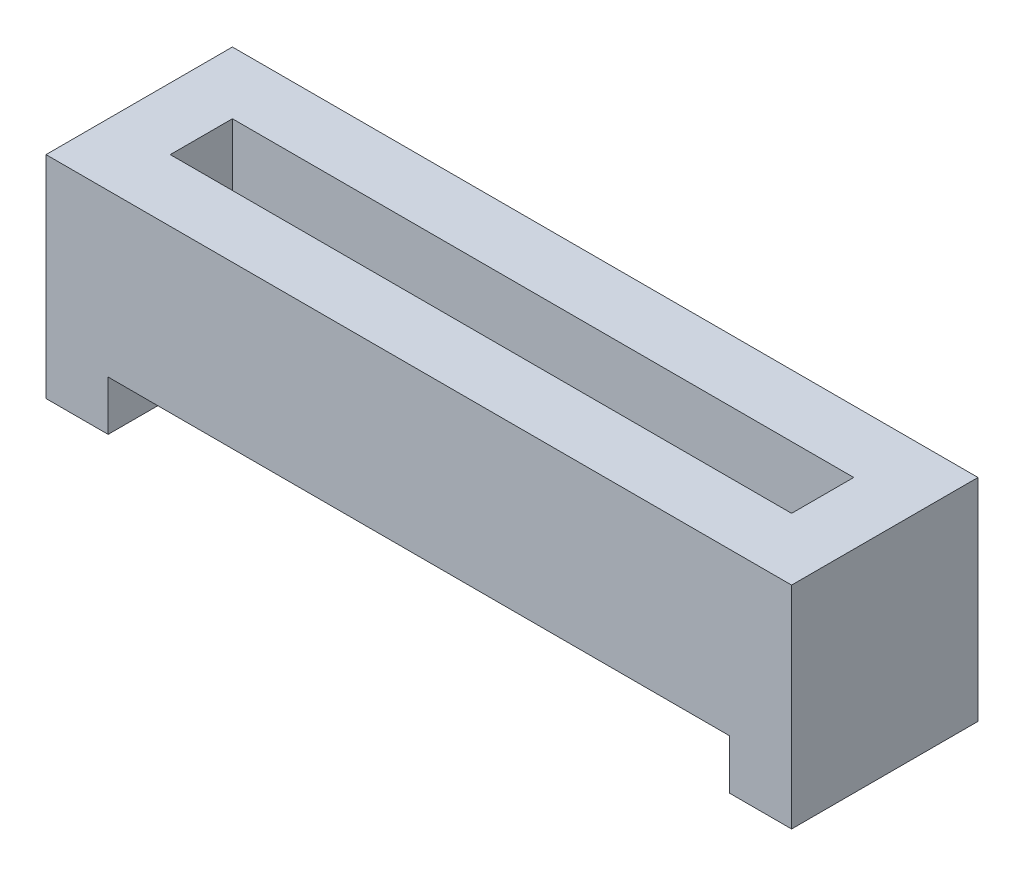
ISO-10303-21;
HEADER;
FILE_DESCRIPTION(('STEP AP214'),'2;1');
FILE_NAME('part.step','',(''),(''),'','','');
FILE_SCHEMA(('AUTOMOTIVE_DESIGN { 1 0 10303 214 1 1 1 1 }'));
ENDSEC;
DATA;
#1=APPLICATION_CONTEXT('core data for automotive mechanical design processes');
#2=APPLICATION_PROTOCOL_DEFINITION('international standard','automotive_design',2000,#1);
#3=PRODUCT_CONTEXT('',#1,'mechanical');
#4=PRODUCT('Part','Part','',(#3));
#5=PRODUCT_RELATED_PRODUCT_CATEGORY('part','',(#4));
#6=PRODUCT_DEFINITION_FORMATION('','',#4);
#7=PRODUCT_DEFINITION_CONTEXT('part definition',#1,'design');
#8=PRODUCT_DEFINITION('design','',#6,#7);
#9=PRODUCT_DEFINITION_SHAPE('','',#8);
#10=(LENGTH_UNIT() NAMED_UNIT(*) SI_UNIT(.MILLI.,.METRE.));
#11=(NAMED_UNIT(*) PLANE_ANGLE_UNIT() SI_UNIT($,.RADIAN.));
#12=(NAMED_UNIT(*) SI_UNIT($,.STERADIAN.) SOLID_ANGLE_UNIT());
#13=UNCERTAINTY_MEASURE_WITH_UNIT(LENGTH_MEASURE(1.E-05),#10,'distance_accuracy_value','');
#14=(GEOMETRIC_REPRESENTATION_CONTEXT(3) GLOBAL_UNCERTAINTY_ASSIGNED_CONTEXT((#13)) GLOBAL_UNIT_ASSIGNED_CONTEXT((#10,
#11,#12)) REPRESENTATION_CONTEXT('',''));
#15=CARTESIAN_POINT('',(0.,0.,0.));
#16=DIRECTION('',(0.,0.,1.));
#17=DIRECTION('',(1.,0.,0.));
#18=AXIS2_PLACEMENT_3D('',#15,#16,#17);
#19=CARTESIAN_POINT('',(30.,13.,7.5));
#20=DIRECTION('',(-1.,0.,0.));
#21=DIRECTION('',(0.,0.,1.));
#22=AXIS2_PLACEMENT_3D('',#19,#20,#21);
#23=PLANE('',#22);
#24=DIRECTION('',(0.,-1.,0.));
#25=VECTOR('',#24,1.);
#26=CARTESIAN_POINT('',(30.,13.,7.5));
#27=LINE('',#26,#25);
#28=CARTESIAN_POINT('',(30.,13.,7.5));
#29=VERTEX_POINT('',#28);
#30=CARTESIAN_POINT('',(30.,-4.,7.5));
#31=VERTEX_POINT('',#30);
#32=EDGE_CURVE('E205',#29,#31,#27,.T.);
#33=ORIENTED_EDGE('',*,*,#32,.T.);
#34=DIRECTION('',(0.,0.,-1.));
#35=VECTOR('',#34,1.);
#36=CARTESIAN_POINT('',(30.,-4.,7.5));
#37=LINE('',#36,#35);
#38=CARTESIAN_POINT('',(30.,-4.,-7.5));
#39=VERTEX_POINT('',#38);
#40=EDGE_CURVE('E158',#31,#39,#37,.T.);
#41=ORIENTED_EDGE('',*,*,#40,.T.);
#42=DIRECTION('',(0.,-1.,0.));
#43=VECTOR('',#42,1.);
#44=CARTESIAN_POINT('',(30.,13.,-7.5));
#45=LINE('',#44,#43);
#46=CARTESIAN_POINT('',(30.,13.,-7.5));
#47=VERTEX_POINT('',#46);
#48=EDGE_CURVE('E11',#47,#39,#45,.T.);
#49=ORIENTED_EDGE('',*,*,#48,.F.);
#50=DIRECTION('',(0.,0.,-1.));
#51=VECTOR('',#50,1.);
#52=CARTESIAN_POINT('',(30.,13.,7.5));
#53=LINE('',#52,#51);
#54=EDGE_CURVE('E195',#29,#47,#53,.T.);
#55=ORIENTED_EDGE('',*,*,#54,.F.);
#56=EDGE_LOOP('',(#33,#41,#49,#55));
#57=FACE_BOUND('',#56,.T.);
#58=ADVANCED_FACE('F33',(#57),#23,.F.);
#59=CARTESIAN_POINT('',(-30.,13.,-7.5));
#60=DIRECTION('',(0.,0.,1.));
#61=DIRECTION('',(1.,0.,0.));
#62=AXIS2_PLACEMENT_3D('',#59,#60,#61);
#63=PLANE('',#62);
#64=ORIENTED_EDGE('',*,*,#48,.T.);
#65=DIRECTION('',(-1.,0.,0.));
#66=VECTOR('',#65,1.);
#67=CARTESIAN_POINT('',(30.,-4.,-7.5));
#68=LINE('',#67,#66);
#69=CARTESIAN_POINT('',(25.,-4.,-7.5));
#70=VERTEX_POINT('',#69);
#71=EDGE_CURVE('E167',#39,#70,#68,.T.);
#72=ORIENTED_EDGE('',*,*,#71,.T.);
#73=DIRECTION('',(0.,1.,0.));
#74=VECTOR('',#73,1.);
#75=CARTESIAN_POINT('',(25.,-4.,-7.5));
#76=LINE('',#75,#74);
#77=CARTESIAN_POINT('',(25.,0.,-7.5));
#78=VERTEX_POINT('',#77);
#79=EDGE_CURVE('E170',#70,#78,#76,.T.);
#80=ORIENTED_EDGE('',*,*,#79,.T.);
#81=DIRECTION('',(-1.,0.,0.));
#82=VECTOR('',#81,1.);
#83=CARTESIAN_POINT('',(-30.,0.,-7.5));
#84=LINE('',#83,#82);
#85=CARTESIAN_POINT('',(-25.,0.,-7.5));
#86=VERTEX_POINT('',#85);
#87=EDGE_CURVE('E194',#78,#86,#84,.T.);
#88=ORIENTED_EDGE('',*,*,#87,.T.);
#89=DIRECTION('',(0.,1.,0.));
#90=VECTOR('',#89,1.);
#91=CARTESIAN_POINT('',(-25.,-4.,-7.5));
#92=LINE('',#91,#90);
#93=CARTESIAN_POINT('',(-25.,-4.,-7.5));
#94=VERTEX_POINT('',#93);
#95=EDGE_CURVE('E191',#94,#86,#92,.T.);
#96=ORIENTED_EDGE('',*,*,#95,.F.);
#97=DIRECTION('',(1.,0.,0.));
#98=VECTOR('',#97,1.);
#99=CARTESIAN_POINT('',(-30.,-4.,-7.5));
#100=LINE('',#99,#98);
#101=CARTESIAN_POINT('',(-30.,-4.,-7.5));
#102=VERTEX_POINT('',#101);
#103=EDGE_CURVE('E179',#102,#94,#100,.T.);
#104=ORIENTED_EDGE('',*,*,#103,.F.);
#105=DIRECTION('',(0.,-1.,0.));
#106=VECTOR('',#105,1.);
#107=CARTESIAN_POINT('',(-30.,13.,-7.5));
#108=LINE('',#107,#106);
#109=CARTESIAN_POINT('',(-30.,13.,-7.5));
#110=VERTEX_POINT('',#109);
#111=EDGE_CURVE('E40',#110,#102,#108,.T.);
#112=ORIENTED_EDGE('',*,*,#111,.F.);
#113=DIRECTION('',(-1.,0.,0.));
#114=VECTOR('',#113,1.);
#115=CARTESIAN_POINT('',(-30.,13.,-7.5));
#116=LINE('',#115,#114);
#117=EDGE_CURVE('E198',#47,#110,#116,.T.);
#118=ORIENTED_EDGE('',*,*,#117,.F.);
#119=EDGE_LOOP('',(#64,#72,#80,#88,#96,#104,#112,#118));
#120=FACE_BOUND('',#119,.T.);
#121=ADVANCED_FACE('F220',(#120),#63,.F.);
#122=CARTESIAN_POINT('',(-30.,13.,7.5));
#123=DIRECTION('',(1.,0.,0.));
#124=DIRECTION('',(0.,0.,-1.));
#125=AXIS2_PLACEMENT_3D('',#122,#123,#124);
#126=PLANE('',#125);
#127=ORIENTED_EDGE('',*,*,#111,.T.);
#128=DIRECTION('',(0.,0.,-1.));
#129=VECTOR('',#128,1.);
#130=CARTESIAN_POINT('',(-30.,-4.,7.5));
#131=LINE('',#130,#129);
#132=CARTESIAN_POINT('',(-30.,-4.,7.5));
#133=VERTEX_POINT('',#132);
#134=EDGE_CURVE('E176',#133,#102,#131,.T.);
#135=ORIENTED_EDGE('',*,*,#134,.F.);
#136=DIRECTION('',(0.,-1.,0.));
#137=VECTOR('',#136,1.);
#138=CARTESIAN_POINT('',(-30.,13.,7.5));
#139=LINE('',#138,#137);
#140=CARTESIAN_POINT('',(-30.,13.,7.5));
#141=VERTEX_POINT('',#140);
#142=EDGE_CURVE('E210',#141,#133,#139,.T.);
#143=ORIENTED_EDGE('',*,*,#142,.F.);
#144=DIRECTION('',(0.,0.,1.));
#145=VECTOR('',#144,1.);
#146=CARTESIAN_POINT('',(-30.,13.,7.5));
#147=LINE('',#146,#145);
#148=EDGE_CURVE('E201',#110,#141,#147,.T.);
#149=ORIENTED_EDGE('',*,*,#148,.F.);
#150=EDGE_LOOP('',(#127,#135,#143,#149));
#151=FACE_BOUND('',#150,.T.);
#152=ADVANCED_FACE('F216',(#151),#126,.F.);
#153=CARTESIAN_POINT('',(-30.,13.,7.5));
#154=DIRECTION('',(0.,0.,-1.));
#155=DIRECTION('',(-1.,0.,0.));
#156=AXIS2_PLACEMENT_3D('',#153,#154,#155);
#157=PLANE('',#156);
#158=ORIENTED_EDGE('',*,*,#142,.T.);
#159=DIRECTION('',(-1.,0.,0.));
#160=VECTOR('',#159,1.);
#161=CARTESIAN_POINT('',(-30.,-4.,7.5));
#162=LINE('',#161,#160);
#163=CARTESIAN_POINT('',(-25.,-4.,7.5));
#164=VERTEX_POINT('',#163);
#165=EDGE_CURVE('E183',#164,#133,#162,.T.);
#166=ORIENTED_EDGE('',*,*,#165,.F.);
#167=DIRECTION('',(0.,1.,0.));
#168=VECTOR('',#167,1.);
#169=CARTESIAN_POINT('',(-25.,-4.,7.5));
#170=LINE('',#169,#168);
#171=CARTESIAN_POINT('',(-25.,0.,7.5));
#172=VERTEX_POINT('',#171);
#173=EDGE_CURVE('E186',#164,#172,#170,.T.);
#174=ORIENTED_EDGE('',*,*,#173,.T.);
#175=DIRECTION('',(1.,0.,0.));
#176=VECTOR('',#175,1.);
#177=CARTESIAN_POINT('',(-30.,0.,7.5));
#178=LINE('',#177,#176);
#179=CARTESIAN_POINT('',(25.,0.,7.5));
#180=VERTEX_POINT('',#179);
#181=EDGE_CURVE('E199',#172,#180,#178,.T.);
#182=ORIENTED_EDGE('',*,*,#181,.T.);
#183=DIRECTION('',(0.,1.,0.));
#184=VECTOR('',#183,1.);
#185=CARTESIAN_POINT('',(25.,-4.,7.5));
#186=LINE('',#185,#184);
#187=CARTESIAN_POINT('',(25.,-4.,7.5));
#188=VERTEX_POINT('',#187);
#189=EDGE_CURVE('E173',#188,#180,#186,.T.);
#190=ORIENTED_EDGE('',*,*,#189,.F.);
#191=DIRECTION('',(1.,0.,0.));
#192=VECTOR('',#191,1.);
#193=CARTESIAN_POINT('',(30.,-4.,7.5));
#194=LINE('',#193,#192);
#195=EDGE_CURVE('E161',#188,#31,#194,.T.);
#196=ORIENTED_EDGE('',*,*,#195,.T.);
#197=ORIENTED_EDGE('',*,*,#32,.F.);
#198=DIRECTION('',(1.,0.,0.));
#199=VECTOR('',#198,1.);
#200=CARTESIAN_POINT('',(-30.,13.,7.5));
#201=LINE('',#200,#199);
#202=EDGE_CURVE('E203',#141,#29,#201,.T.);
#203=ORIENTED_EDGE('',*,*,#202,.F.);
#204=EDGE_LOOP('',(#158,#166,#174,#182,#190,#196,#197,#203));
#205=FACE_BOUND('',#204,.T.);
#206=ADVANCED_FACE('F227',(#205),#157,.F.);
#207=CARTESIAN_POINT('',(0.,13.,0.));
#208=DIRECTION('',(0.,-1.,0.));
#209=DIRECTION('',(0.,0.,-1.));
#210=AXIS2_PLACEMENT_3D('',#207,#208,#209);
#211=PLANE('',#210);
#212=DIRECTION('',(-1.,0.,0.));
#213=VECTOR('',#212,1.);
#214=CARTESIAN_POINT('',(-25.,13.,-2.5));
#215=LINE('',#214,#213);
#216=CARTESIAN_POINT('',(25.,13.,-2.5));
#217=VERTEX_POINT('',#216);
#218=CARTESIAN_POINT('',(-25.,13.,-2.5));
#219=VERTEX_POINT('',#218);
#220=EDGE_CURVE('E149',#217,#219,#215,.T.);
#221=ORIENTED_EDGE('',*,*,#220,.F.);
#222=DIRECTION('',(0.,0.,-1.));
#223=VECTOR('',#222,1.);
#224=CARTESIAN_POINT('',(25.,13.,2.5));
#225=LINE('',#224,#223);
#226=CARTESIAN_POINT('',(25.,13.,2.5));
#227=VERTEX_POINT('',#226);
#228=EDGE_CURVE('E47',#227,#217,#225,.T.);
#229=ORIENTED_EDGE('',*,*,#228,.F.);
#230=DIRECTION('',(1.,0.,0.));
#231=VECTOR('',#230,1.);
#232=CARTESIAN_POINT('',(-25.,13.,2.5));
#233=LINE('',#232,#231);
#234=CARTESIAN_POINT('',(-25.,13.,2.5));
#235=VERTEX_POINT('',#234);
#236=EDGE_CURVE('E140',#235,#227,#233,.T.);
#237=ORIENTED_EDGE('',*,*,#236,.F.);
#238=DIRECTION('',(0.,0.,1.));
#239=VECTOR('',#238,1.);
#240=CARTESIAN_POINT('',(-25.,13.,2.5));
#241=LINE('',#240,#239);
#242=EDGE_CURVE('E143',#219,#235,#241,.T.);
#243=ORIENTED_EDGE('',*,*,#242,.F.);
#244=EDGE_LOOP('',(#221,#229,#237,#243));
#245=FACE_BOUND('',#244,.T.);
#246=ORIENTED_EDGE('',*,*,#54,.T.);
#247=ORIENTED_EDGE('',*,*,#117,.T.);
#248=ORIENTED_EDGE('',*,*,#148,.T.);
#249=ORIENTED_EDGE('',*,*,#202,.T.);
#250=EDGE_LOOP('',(#246,#247,#248,#249));
#251=FACE_BOUND('',#250,.T.);
#252=ADVANCED_FACE('F232',(#245,#251),#211,.F.);
#253=CARTESIAN_POINT('',(0.,0.,0.));
#254=DIRECTION('',(0.,-1.,0.));
#255=DIRECTION('',(0.,0.,-1.));
#256=AXIS2_PLACEMENT_3D('',#253,#254,#255);
#257=PLANE('',#256);
#258=DIRECTION('',(0.,0.,1.));
#259=VECTOR('',#258,1.);
#260=CARTESIAN_POINT('',(25.,0.,7.5));
#261=LINE('',#260,#259);
#262=EDGE_CURVE('E55',#78,#180,#261,.T.);
#263=ORIENTED_EDGE('',*,*,#262,.T.);
#264=ORIENTED_EDGE('',*,*,#181,.F.);
#265=DIRECTION('',(0.,0.,1.));
#266=VECTOR('',#265,1.);
#267=CARTESIAN_POINT('',(-25.,0.,7.5));
#268=LINE('',#267,#266);
#269=EDGE_CURVE('E175',#86,#172,#268,.T.);
#270=ORIENTED_EDGE('',*,*,#269,.F.);
#271=ORIENTED_EDGE('',*,*,#87,.F.);
#272=EDGE_LOOP('',(#263,#264,#270,#271));
#273=FACE_BOUND('',#272,.T.);
#274=ADVANCED_FACE('F245',(#273),#257,.T.);
#275=CARTESIAN_POINT('',(-25.,-4.,7.5));
#276=DIRECTION('',(-1.,0.,0.));
#277=DIRECTION('',(0.,0.,1.));
#278=AXIS2_PLACEMENT_3D('',#275,#276,#277);
#279=PLANE('',#278);
#280=ORIENTED_EDGE('',*,*,#269,.T.);
#281=ORIENTED_EDGE('',*,*,#173,.F.);
#282=DIRECTION('',(0.,0.,1.));
#283=VECTOR('',#282,1.);
#284=CARTESIAN_POINT('',(-25.,-4.,7.5));
#285=LINE('',#284,#283);
#286=EDGE_CURVE('E181',#94,#164,#285,.T.);
#287=ORIENTED_EDGE('',*,*,#286,.F.);
#288=ORIENTED_EDGE('',*,*,#95,.T.);
#289=EDGE_LOOP('',(#280,#281,#287,#288));
#290=FACE_BOUND('',#289,.T.);
#291=ADVANCED_FACE('F247',(#290),#279,.F.);
#292=CARTESIAN_POINT('',(0.,-4.,0.));
#293=DIRECTION('',(0.,-1.,0.));
#294=DIRECTION('',(0.,0.,-1.));
#295=AXIS2_PLACEMENT_3D('',#292,#293,#294);
#296=PLANE('',#295);
#297=ORIENTED_EDGE('',*,*,#134,.T.);
#298=ORIENTED_EDGE('',*,*,#103,.T.);
#299=ORIENTED_EDGE('',*,*,#286,.T.);
#300=ORIENTED_EDGE('',*,*,#165,.T.);
#301=EDGE_LOOP('',(#297,#298,#299,#300));
#302=FACE_BOUND('',#301,.T.);
#303=ADVANCED_FACE('F223',(#302),#296,.T.);
#304=CARTESIAN_POINT('',(25.,-4.,7.5));
#305=DIRECTION('',(-1.,0.,0.));
#306=DIRECTION('',(0.,0.,1.));
#307=AXIS2_PLACEMENT_3D('',#304,#305,#306);
#308=PLANE('',#307);
#309=ORIENTED_EDGE('',*,*,#262,.F.);
#310=ORIENTED_EDGE('',*,*,#79,.F.);
#311=DIRECTION('',(0.,0.,1.));
#312=VECTOR('',#311,1.);
#313=CARTESIAN_POINT('',(25.,-4.,7.5));
#314=LINE('',#313,#312);
#315=EDGE_CURVE('E164',#70,#188,#314,.T.);
#316=ORIENTED_EDGE('',*,*,#315,.T.);
#317=ORIENTED_EDGE('',*,*,#189,.T.);
#318=EDGE_LOOP('',(#309,#310,#316,#317));
#319=FACE_BOUND('',#318,.T.);
#320=ADVANCED_FACE('F241',(#319),#308,.T.);
#321=CARTESIAN_POINT('',(0.,-4.,0.));
#322=DIRECTION('',(0.,-1.,0.));
#323=DIRECTION('',(0.,0.,-1.));
#324=AXIS2_PLACEMENT_3D('',#321,#322,#323);
#325=PLANE('',#324);
#326=ORIENTED_EDGE('',*,*,#40,.F.);
#327=ORIENTED_EDGE('',*,*,#195,.F.);
#328=ORIENTED_EDGE('',*,*,#315,.F.);
#329=ORIENTED_EDGE('',*,*,#71,.F.);
#330=EDGE_LOOP('',(#326,#327,#328,#329));
#331=FACE_BOUND('',#330,.T.);
#332=ADVANCED_FACE('F240',(#331),#325,.T.);
#333=CARTESIAN_POINT('',(25.,3.,2.5));
#334=DIRECTION('',(1.,0.,0.));
#335=DIRECTION('',(0.,0.,-1.));
#336=AXIS2_PLACEMENT_3D('',#333,#334,#335);
#337=PLANE('',#336);
#338=ORIENTED_EDGE('',*,*,#228,.T.);
#339=DIRECTION('',(0.,1.,0.));
#340=VECTOR('',#339,1.);
#341=CARTESIAN_POINT('',(25.,3.,-2.5));
#342=LINE('',#341,#340);
#343=CARTESIAN_POINT('',(25.,3.,-2.5));
#344=VERTEX_POINT('',#343);
#345=EDGE_CURVE('E118',#344,#217,#342,.T.);
#346=ORIENTED_EDGE('',*,*,#345,.F.);
#347=DIRECTION('',(0.,0.,-1.));
#348=VECTOR('',#347,1.);
#349=CARTESIAN_POINT('',(25.,3.,2.5));
#350=LINE('',#349,#348);
#351=CARTESIAN_POINT('',(25.,3.,2.5));
#352=VERTEX_POINT('',#351);
#353=EDGE_CURVE('E122',#352,#344,#350,.T.);
#354=ORIENTED_EDGE('',*,*,#353,.F.);
#355=DIRECTION('',(0.,1.,0.));
#356=VECTOR('',#355,1.);
#357=CARTESIAN_POINT('',(25.,3.,2.5));
#358=LINE('',#357,#356);
#359=EDGE_CURVE('E153',#352,#227,#358,.T.);
#360=ORIENTED_EDGE('',*,*,#359,.T.);
#361=EDGE_LOOP('',(#338,#346,#354,#360));
#362=FACE_BOUND('',#361,.T.);
#363=ADVANCED_FACE('F120',(#362),#337,.F.);
#364=CARTESIAN_POINT('',(-25.,3.,2.5));
#365=DIRECTION('',(0.,0.,1.));
#366=DIRECTION('',(1.,0.,0.));
#367=AXIS2_PLACEMENT_3D('',#364,#365,#366);
#368=PLANE('',#367);
#369=ORIENTED_EDGE('',*,*,#236,.T.);
#370=ORIENTED_EDGE('',*,*,#359,.F.);
#371=DIRECTION('',(1.,0.,0.));
#372=VECTOR('',#371,1.);
#373=CARTESIAN_POINT('',(-25.,3.,2.5));
#374=LINE('',#373,#372);
#375=CARTESIAN_POINT('',(-25.,3.,2.5));
#376=VERTEX_POINT('',#375);
#377=EDGE_CURVE('E128',#376,#352,#374,.T.);
#378=ORIENTED_EDGE('',*,*,#377,.F.);
#379=DIRECTION('',(0.,1.,0.));
#380=VECTOR('',#379,1.);
#381=CARTESIAN_POINT('',(-25.,3.,2.5));
#382=LINE('',#381,#380);
#383=EDGE_CURVE('E155',#376,#235,#382,.T.);
#384=ORIENTED_EDGE('',*,*,#383,.T.);
#385=EDGE_LOOP('',(#369,#370,#378,#384));
#386=FACE_BOUND('',#385,.T.);
#387=ADVANCED_FACE('F276',(#386),#368,.F.);
#388=CARTESIAN_POINT('',(-25.,3.,2.5));
#389=DIRECTION('',(-1.,0.,0.));
#390=DIRECTION('',(0.,0.,1.));
#391=AXIS2_PLACEMENT_3D('',#388,#389,#390);
#392=PLANE('',#391);
#393=ORIENTED_EDGE('',*,*,#242,.T.);
#394=ORIENTED_EDGE('',*,*,#383,.F.);
#395=DIRECTION('',(0.,0.,1.));
#396=VECTOR('',#395,1.);
#397=CARTESIAN_POINT('',(-25.,3.,2.5));
#398=LINE('',#397,#396);
#399=CARTESIAN_POINT('',(-25.,3.,-2.5));
#400=VERTEX_POINT('',#399);
#401=EDGE_CURVE('E136',#400,#376,#398,.T.);
#402=ORIENTED_EDGE('',*,*,#401,.F.);
#403=DIRECTION('',(0.,1.,0.));
#404=VECTOR('',#403,1.);
#405=CARTESIAN_POINT('',(-25.,3.,-2.5));
#406=LINE('',#405,#404);
#407=EDGE_CURVE('E127',#400,#219,#406,.T.);
#408=ORIENTED_EDGE('',*,*,#407,.T.);
#409=EDGE_LOOP('',(#393,#394,#402,#408));
#410=FACE_BOUND('',#409,.T.);
#411=ADVANCED_FACE('F274',(#410),#392,.F.);
#412=CARTESIAN_POINT('',(-25.,3.,-2.5));
#413=DIRECTION('',(0.,0.,-1.));
#414=DIRECTION('',(-1.,0.,0.));
#415=AXIS2_PLACEMENT_3D('',#412,#413,#414);
#416=PLANE('',#415);
#417=ORIENTED_EDGE('',*,*,#220,.T.);
#418=ORIENTED_EDGE('',*,*,#407,.F.);
#419=DIRECTION('',(-1.,0.,0.));
#420=VECTOR('',#419,1.);
#421=CARTESIAN_POINT('',(-25.,3.,-2.5));
#422=LINE('',#421,#420);
#423=EDGE_CURVE('E131',#344,#400,#422,.T.);
#424=ORIENTED_EDGE('',*,*,#423,.F.);
#425=ORIENTED_EDGE('',*,*,#345,.T.);
#426=EDGE_LOOP('',(#417,#418,#424,#425));
#427=FACE_BOUND('',#426,.T.);
#428=ADVANCED_FACE('F132',(#427),#416,.F.);
#429=CARTESIAN_POINT('',(0.,3.,0.));
#430=DIRECTION('',(0.,-1.,0.));
#431=DIRECTION('',(0.,0.,-1.));
#432=AXIS2_PLACEMENT_3D('',#429,#430,#431);
#433=PLANE('',#432);
#434=ORIENTED_EDGE('',*,*,#353,.T.);
#435=ORIENTED_EDGE('',*,*,#423,.T.);
#436=ORIENTED_EDGE('',*,*,#401,.T.);
#437=ORIENTED_EDGE('',*,*,#377,.T.);
#438=EDGE_LOOP('',(#434,#435,#436,#437));
#439=FACE_BOUND('',#438,.T.);
#440=ADVANCED_FACE('F138',(#439),#433,.F.);
#441=CLOSED_SHELL('',(#58,#121,#152,#206,#252,#274,#291,#303,#320,#332,#363,#387,#411,#428,#440));
#442=MANIFOLD_SOLID_BREP('B2',#441);
#443=ADVANCED_BREP_SHAPE_REPRESENTATION('',(#18,#442),#14);
#444=SHAPE_DEFINITION_REPRESENTATION(#9,#443);
ENDSEC;
END-ISO-10303-21;
